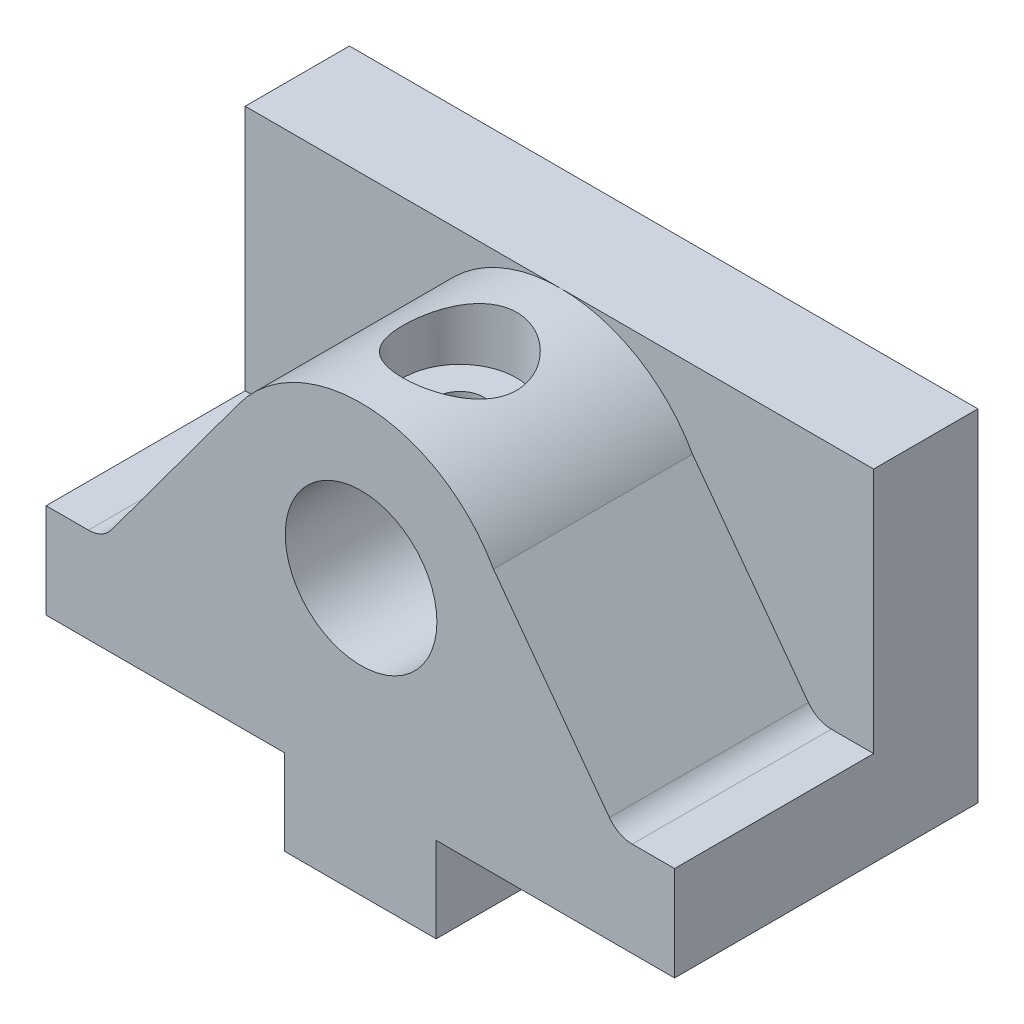
ISO-10303-21;
HEADER;
FILE_DESCRIPTION(('STEP AP214'),'2;1');
FILE_NAME('part.step','',(''),(''),'','','');
FILE_SCHEMA(('AUTOMOTIVE_DESIGN { 1 0 10303 214 1 1 1 1 }'));
ENDSEC;
DATA;
#1=APPLICATION_CONTEXT('core data for automotive mechanical design processes');
#2=APPLICATION_PROTOCOL_DEFINITION('international standard','automotive_design',2000,#1);
#3=PRODUCT_CONTEXT('',#1,'mechanical');
#4=PRODUCT('Part','Part','',(#3));
#5=PRODUCT_RELATED_PRODUCT_CATEGORY('part','',(#4));
#6=PRODUCT_DEFINITION_FORMATION('','',#4);
#7=PRODUCT_DEFINITION_CONTEXT('part definition',#1,'design');
#8=PRODUCT_DEFINITION('design','',#6,#7);
#9=PRODUCT_DEFINITION_SHAPE('','',#8);
#10=(LENGTH_UNIT() NAMED_UNIT(*) SI_UNIT(.MILLI.,.METRE.));
#11=(NAMED_UNIT(*) PLANE_ANGLE_UNIT() SI_UNIT($,.RADIAN.));
#12=(NAMED_UNIT(*) SI_UNIT($,.STERADIAN.) SOLID_ANGLE_UNIT());
#13=UNCERTAINTY_MEASURE_WITH_UNIT(LENGTH_MEASURE(1.E-05),#10,'distance_accuracy_value','');
#14=(GEOMETRIC_REPRESENTATION_CONTEXT(3) GLOBAL_UNCERTAINTY_ASSIGNED_CONTEXT((#13)) GLOBAL_UNIT_ASSIGNED_CONTEXT((#10,
#11,#12)) REPRESENTATION_CONTEXT('',''));
#15=CARTESIAN_POINT('',(0.,0.,0.));
#16=DIRECTION('',(0.,0.,1.));
#17=DIRECTION('',(1.,0.,0.));
#18=AXIS2_PLACEMENT_3D('',#15,#16,#17);
#19=CARTESIAN_POINT('',(0.,0.,0.));
#20=DIRECTION('',(0.,0.,1.));
#21=DIRECTION('',(1.,0.,0.));
#22=AXIS2_PLACEMENT_3D('',#19,#20,#21);
#23=PLANE('',#22);
#24=DIRECTION('',(-1.,0.,0.));
#25=VECTOR('',#24,1.);
#26=CARTESIAN_POINT('',(33.15,-16.,0.));
#27=LINE('',#26,#25);
#28=CARTESIAN_POINT('',(8.,-16.,0.));
#29=VERTEX_POINT('',#28);
#30=CARTESIAN_POINT('',(-8.,-16.,0.));
#31=VERTEX_POINT('',#30);
#32=EDGE_CURVE('E50',#29,#31,#27,.T.);
#33=ORIENTED_EDGE('',*,*,#32,.F.);
#34=DIRECTION('',(0.,1.,0.));
#35=VECTOR('',#34,1.);
#36=CARTESIAN_POINT('',(8.,0.,0.));
#37=LINE('',#36,#35);
#38=CARTESIAN_POINT('',(8.,-25.,0.));
#39=VERTEX_POINT('',#38);
#40=EDGE_CURVE('E182',#39,#29,#37,.T.);
#41=ORIENTED_EDGE('',*,*,#40,.F.);
#42=DIRECTION('',(1.,0.,0.));
#43=VECTOR('',#42,1.);
#44=CARTESIAN_POINT('',(0.,-25.,0.));
#45=LINE('',#44,#43);
#46=CARTESIAN_POINT('',(-8.,-25.,0.));
#47=VERTEX_POINT('',#46);
#48=EDGE_CURVE('E81',#47,#39,#45,.T.);
#49=ORIENTED_EDGE('',*,*,#48,.F.);
#50=DIRECTION('',(0.,-1.,0.));
#51=VECTOR('',#50,1.);
#52=CARTESIAN_POINT('',(-8.,0.,0.));
#53=LINE('',#52,#51);
#54=EDGE_CURVE('E74',#31,#47,#53,.T.);
#55=ORIENTED_EDGE('',*,*,#54,.F.);
#56=EDGE_LOOP('',(#33,#41,#49,#55));
#57=FACE_BOUND('',#56,.T.);
#58=ADVANCED_FACE('F37',(#57),#23,.F.);
#59=CARTESIAN_POINT('',(14.737760130452,10.8656138690284,21.));
#60=DIRECTION('',(0.804893797355911,0.593418886603705,0.));
#61=DIRECTION('',(-0.593418886603705,0.804893797355911,0.));
#62=AXIS2_PLACEMENT_3D('',#59,#60,#61);
#63=PLANE('',#62);
#64=DIRECTION('',(0.593418886603705,-0.804893797355911,0.));
#65=VECTOR('',#64,1.);
#66=CARTESIAN_POINT('',(14.737760130452,10.8656138690284,0.));
#67=LINE('',#66,#65);
#68=CARTESIAN_POINT('',(14.0487403505157,11.8001775636562,0.));
#69=VERTEX_POINT('',#68);
#70=CARTESIAN_POINT('',(26.2728907273948,-4.7802566598111,0.));
#71=VERTEX_POINT('',#70);
#72=EDGE_CURVE('E163',#69,#71,#67,.T.);
#73=ORIENTED_EDGE('',*,*,#72,.F.);
#74=DIRECTION('',(0.,0.,-1.));
#75=VECTOR('',#74,1.);
#76=CARTESIAN_POINT('',(14.0487403505157,11.8001775636562,21.));
#77=LINE('',#76,#75);
#78=CARTESIAN_POINT('',(14.0487403505157,11.8001775636562,21.));
#79=VERTEX_POINT('',#78);
#80=EDGE_CURVE('E89',#79,#69,#77,.T.);
#81=ORIENTED_EDGE('',*,*,#80,.F.);
#82=DIRECTION('',(0.593418886603705,-0.804893797355911,0.));
#83=VECTOR('',#82,1.);
#84=CARTESIAN_POINT('',(14.737760130452,10.8656138690284,21.));
#85=LINE('',#84,#83);
#86=CARTESIAN_POINT('',(26.2728907273948,-4.7802566598111,21.));
#87=VERTEX_POINT('',#86);
#88=EDGE_CURVE('E193',#79,#87,#85,.T.);
#89=ORIENTED_EDGE('',*,*,#88,.T.);
#90=DIRECTION('',(0.,0.,-1.));
#91=VECTOR('',#90,1.);
#92=CARTESIAN_POINT('',(26.2728907273948,-4.7802566598111,21.));
#93=LINE('',#92,#91);
#94=EDGE_CURVE('E58',#87,#71,#93,.T.);
#95=ORIENTED_EDGE('',*,*,#94,.T.);
#96=EDGE_LOOP('',(#73,#81,#89,#95));
#97=FACE_BOUND('',#96,.T.);
#98=ADVANCED_FACE('F39',(#97),#63,.T.);
#99=CARTESIAN_POINT('',(0.0788717049115105,4.,21.));
#100=DIRECTION('',(0.,0.,-1.));
#101=DIRECTION('',(-1.,0.,0.));
#102=AXIS2_PLACEMENT_3D('',#99,#100,#101);
#103=CYLINDRICAL_SURFACE('',#102,16.);
#104=CARTESIAN_POINT('',(0.,19.9998056005117,16.5));
#105=CARTESIAN_POINT('',(-0.162597875480662,19.9990046002663,16.5000007288626));
#106=CARTESIAN_POINT('',(-0.325173391870879,19.995718639908,16.4933854366661));
#107=CARTESIAN_POINT('',(-0.649138194896601,19.9842508954801,16.466995699932));
#108=CARTESIAN_POINT('',(-0.810527057658233,19.9760674405622,16.4472167641761));
#109=CARTESIAN_POINT('',(-1.13078166197335,19.9550142850118,16.3947138411218));
#110=CARTESIAN_POINT('',(-1.28964869250002,19.9421470645064,16.3619967040126));
#111=CARTESIAN_POINT('',(-1.60388528633919,19.9120474207244,16.283923659696));
#112=CARTESIAN_POINT('',(-1.7592534624636,19.8948132981638,16.238562831785));
#113=CARTESIAN_POINT('',(-2.06501428051281,19.8564636415179,16.1357492956797));
#114=CARTESIAN_POINT('',(-2.21541800053417,19.8353575518401,16.0783259616611));
#115=CARTESIAN_POINT('',(-2.5107498974902,19.7897497261244,15.951784509422));
#116=CARTESIAN_POINT('',(-2.65567602022029,19.7652467319505,15.8826620560099));
#117=CARTESIAN_POINT('',(-2.93911672030895,19.7134496809109,15.7332832241983));
#118=CARTESIAN_POINT('',(-3.07763224861664,19.6861560399505,15.6530285042676));
#119=CARTESIAN_POINT('',(-3.34755017289116,19.6294165638612,15.4819125836238));
#120=CARTESIAN_POINT('',(-3.47894997600853,19.5999699532904,15.3910475542561));
#121=CARTESIAN_POINT('',(-3.73884381576997,19.538454493063,15.19558330503));
#122=CARTESIAN_POINT('',(-3.86702595466461,19.5063281965068,15.0905873088505));
#123=CARTESIAN_POINT('',(-4.11417333234845,19.4413310328946,14.8704649698221));
#124=CARTESIAN_POINT('',(-4.23313830489977,19.4084601443665,14.7553383345546));
#125=CARTESIAN_POINT('',(-4.46122140919626,19.3428043873285,14.515581152897));
#126=CARTESIAN_POINT('',(-4.57033490036089,19.3100195663481,14.3909461780393));
#127=CARTESIAN_POINT('',(-4.77796061785949,19.2454255113921,14.1329737382526));
#128=CARTESIAN_POINT('',(-4.87647643110741,19.2136159499509,13.9996392424858));
#129=CARTESIAN_POINT('',(-5.06586799817801,19.1506433016703,13.719722871633));
#130=CARTESIAN_POINT('',(-5.1563077404197,19.119551409726,13.5728294324502));
#131=CARTESIAN_POINT('',(-5.32438637622011,19.0603035766139,13.2714028387049));
#132=CARTESIAN_POINT('',(-5.40203043794046,19.0321464517942,13.1168728014997));
#133=CARTESIAN_POINT('',(-5.54389918412248,18.9796586455666,12.8011171038103));
#134=CARTESIAN_POINT('',(-5.60812248555749,18.9553283585832,12.6398907553126));
#135=CARTESIAN_POINT('',(-5.72248773771458,18.9113375216964,12.3119786731396));
#136=CARTESIAN_POINT('',(-5.77263654057185,18.8916747001704,12.1452956403285));
#137=CARTESIAN_POINT('',(-5.85653064325913,18.8584302139801,11.8148606524755));
#138=CARTESIAN_POINT('',(-5.89088237292996,18.8446256661589,11.6512850703775));
#139=CARTESIAN_POINT('',(-5.94583747612751,18.8224074031864,11.321546200458));
#140=CARTESIAN_POINT('',(-5.96644690073887,18.8139913154246,11.1553840845798));
#141=CARTESIAN_POINT('',(-5.99370365788102,18.8028391322993,10.8217538870913));
#142=CARTESIAN_POINT('',(-6.00035317407108,18.8001021485906,10.6542860138465));
#143=CARTESIAN_POINT('',(-5.99961795227876,18.8004042197552,10.3193897199229));
#144=CARTESIAN_POINT('',(-5.99223376879577,18.8034430464148,10.1519612979467));
#145=CARTESIAN_POINT('',(-5.96440529544634,18.8148239363387,9.82878030580884));
#146=CARTESIAN_POINT('',(-5.94479273184622,18.822828112734,9.67294331084163));
#147=CARTESIAN_POINT('',(-5.89347606307572,18.8435786664687,9.36354148897527));
#148=CARTESIAN_POINT('',(-5.86176794879023,18.8563266161151,9.20997743300024));
#149=CARTESIAN_POINT('',(-5.78657137684794,18.8861751355065,8.90624189653167));
#150=CARTESIAN_POINT('',(-5.74308594278921,18.9032745880197,8.75606955598689));
#151=CARTESIAN_POINT('',(-5.64469534376389,18.9413373124076,8.45995933227345));
#152=CARTESIAN_POINT('',(-5.5897858078627,18.9623020628195,8.31402309428915));
#153=CARTESIAN_POINT('',(-5.46783755557311,19.0079423401382,8.02454209573903));
#154=CARTESIAN_POINT('',(-5.40058633917315,19.032681345374,7.88109693907999));
#155=CARTESIAN_POINT('',(-5.25517054267194,19.0848917879836,7.60031218287696));
#156=CARTESIAN_POINT('',(-5.17700225456706,19.1123641528324,7.46297467879231));
#157=CARTESIAN_POINT('',(-5.0102874788706,19.1693182520026,7.19517008102259));
#158=CARTESIAN_POINT('',(-4.92173979689313,19.1988002174106,7.06470378053458));
#159=CARTESIAN_POINT('',(-4.73481295801729,19.2590327782618,6.81132338881349));
#160=CARTESIAN_POINT('',(-4.63643334249973,19.2897834328447,6.68840965030855));
#161=CARTESIAN_POINT('',(-4.42325162525514,19.3539609394907,6.44252263027109));
#162=CARTESIAN_POINT('',(-4.30778391781587,19.3874255754358,6.32013548113781));
#163=CARTESIAN_POINT('',(-4.06697642974933,19.4540461733923,6.08548326582083));
#164=CARTESIAN_POINT('',(-3.94163963069466,19.4872022252714,5.97321516436559));
#165=CARTESIAN_POINT('',(-3.68172451053045,19.5523590680355,5.75940553093412));
#166=CARTESIAN_POINT('',(-3.54714121689138,19.5843592229709,5.65786984626786));
#167=CARTESIAN_POINT('',(-3.2696425671514,19.6463303375856,5.46632847252391));
#168=CARTESIAN_POINT('',(-3.12673055368211,19.6763021010388,5.37631820360189));
#169=CARTESIAN_POINT('',(-2.83084097503339,19.7339339657032,5.2069956619691));
#170=CARTESIAN_POINT('',(-2.67773160503509,19.7615448143443,5.12789660200632));
#171=CARTESIAN_POINT('',(-2.36481792766893,19.8130803349705,4.98299442543059));
#172=CARTESIAN_POINT('',(-2.20501630347863,19.8370064666375,4.91718604055067));
#173=CARTESIAN_POINT('',(-1.8798226830721,19.8805043854684,4.7994593846713));
#174=CARTESIAN_POINT('',(-1.71443154149499,19.900076834873,4.74753900091751));
#175=CARTESIAN_POINT('',(-1.3793004219006,19.9343056453706,4.65811657866493));
#176=CARTESIAN_POINT('',(-1.20956070826838,19.9489623045746,4.62061366581936));
#177=CARTESIAN_POINT('',(-0.876240061379153,19.9722938226187,4.56204649754794));
#178=CARTESIAN_POINT('',(-0.712813527565855,19.9812460401906,4.54021213397568));
#179=CARTESIAN_POINT('',(-0.384523603016817,19.9941315625461,4.51006606080527));
#180=CARTESIAN_POINT('',(-0.219660274748985,19.9980650844438,4.50175376622407));
#181=CARTESIAN_POINT('',(0.110199769038095,20.0008193034233,4.49874547756202));
#182=CARTESIAN_POINT('',(0.27519645166177,19.9996410132456,4.50404678630002));
#183=CARTESIAN_POINT('',(0.604076963418254,19.9922234908994,4.52820997357424));
#184=CARTESIAN_POINT('',(0.767960810921134,19.9859843424785,4.54707162771171));
#185=CARTESIAN_POINT('',(1.08684439337686,19.9689843363227,4.59713903301461));
#186=CARTESIAN_POINT('',(1.2419370998143,19.9584145417338,4.62782025634377));
#187=CARTESIAN_POINT('',(1.54894456169723,19.9330668122344,4.70123378567702));
#188=CARTESIAN_POINT('',(1.70085825311639,19.9182874918213,4.74397005937631));
#189=CARTESIAN_POINT('',(2.00042622233181,19.8849091514048,4.8411057957064));
#190=CARTESIAN_POINT('',(2.14808166692555,19.8663111893052,4.89550202828439));
#191=CARTESIAN_POINT('',(2.43832789150545,19.8257527408023,5.0155463816344));
#192=CARTESIAN_POINT('',(2.58091672437084,19.8037909785319,5.08119877292567));
#193=CARTESIAN_POINT('',(2.86401314650287,19.7564003183358,5.22521635259312));
#194=CARTESIAN_POINT('',(3.0043541646735,19.7308923415817,5.30388286832287));
#195=CARTESIAN_POINT('',(3.2779969334092,19.677532971866,5.47202476683449));
#196=CARTESIAN_POINT('',(3.41129624435998,19.6496807752991,5.56150386081649));
#197=CARTESIAN_POINT('',(3.670091977007,19.5923284835017,5.7506717776728));
#198=CARTESIAN_POINT('',(3.79558730281286,19.5628281579285,5.85036202928969));
#199=CARTESIAN_POINT('',(4.03808530524385,19.5029103806121,6.05933690474149));
#200=CARTESIAN_POINT('',(4.15508766986317,19.4724928952333,6.16862188073212));
#201=CARTESIAN_POINT('',(4.38646580046857,19.4097313478496,6.40273947537762));
#202=CARTESIAN_POINT('',(4.50029991492092,19.3773774462054,6.52810545378596));
#203=CARTESIAN_POINT('',(4.71701594958987,19.3134053222147,6.7880746461822));
#204=CARTESIAN_POINT('',(4.8199013580719,19.2817868680781,6.92267489551107));
#205=CARTESIAN_POINT('',(5.01413007017098,19.2201712689675,7.20041985036751));
#206=CARTESIAN_POINT('',(5.10546757630218,19.1901749426538,7.34356879498736));
#207=CARTESIAN_POINT('',(5.27583869722682,19.1327332683385,7.63742131457219));
#208=CARTESIAN_POINT('',(5.35487745157578,19.1052868566894,7.78812169885227));
#209=CARTESIAN_POINT('',(5.50046227951491,19.0536493510489,8.09703713087115));
#210=CARTESIAN_POINT('',(5.56693629688538,19.0294772459765,8.25528936846913));
#211=CARTESIAN_POINT('',(5.68620944188024,18.9853865245205,8.57737203366088));
#212=CARTESIAN_POINT('',(5.73901425861978,18.9654661391807,8.7412001083668));
#213=CARTESIAN_POINT('',(5.83043670465923,18.9305692286101,9.07323802415519));
#214=CARTESIAN_POINT('',(5.86905841377772,18.915591281796,9.24144659024155));
#215=CARTESIAN_POINT('',(5.93170627964781,18.8911203012282,9.58095090903826));
#216=CARTESIAN_POINT('',(5.95573342229305,18.8816268969842,9.75224645241172));
#217=CARTESIAN_POINT('',(5.98787856954863,18.8688908051387,10.0857516860936));
#218=CARTESIAN_POINT('',(5.99689519681476,18.8652952543096,10.2478618747385));
#219=CARTESIAN_POINT('',(6.00175729462009,18.8633588042937,10.5723093456874));
#220=CARTESIAN_POINT('',(5.99760319139971,18.8650177350576,10.7346466204724));
#221=CARTESIAN_POINT('',(5.9761698743065,18.8735337288522,11.0582963603953));
#222=CARTESIAN_POINT('',(5.95889191968373,18.8803902931631,11.2196089223584));
#223=CARTESIAN_POINT('',(5.91139435919661,18.8990714135797,11.5400227599637));
#224=CARTESIAN_POINT('',(5.88117476358134,18.910895965751,11.699124037357));
#225=CARTESIAN_POINT('',(5.809196590441,18.9387019274852,12.0092409779039));
#226=CARTESIAN_POINT('',(5.76781209247374,18.9545477295621,12.160355939962));
#227=CARTESIAN_POINT('',(5.67350338552309,18.9900845337431,12.4585251216294));
#228=CARTESIAN_POINT('',(5.62057537229106,19.0097768032543,12.6055779845021));
#229=CARTESIAN_POINT('',(5.50361606975496,19.0524423031683,12.8946847594003));
#230=CARTESIAN_POINT('',(5.43958645208076,19.0754150395213,13.0367394201645));
#231=CARTESIAN_POINT('',(5.30088763864341,19.1240189176861,13.3151029100444));
#232=CARTESIAN_POINT('',(5.22621459569243,19.1496510198404,13.4514096383169));
#233=CARTESIAN_POINT('',(4.97884567622273,19.2322517396299,13.8641102427098));
#234=CARTESIAN_POINT('',(4.78870330000843,19.2926665169483,14.1296104002842));
#235=CARTESIAN_POINT('',(4.36823694104577,19.4158739284026,14.6260614243027));
#236=CARTESIAN_POINT('',(4.13790050279399,19.4786672948894,14.8570015398077));
#237=CARTESIAN_POINT('',(3.75990823604686,19.5713861973601,15.1789395307698));
#238=CARTESIAN_POINT('',(3.62472407690408,19.6028003622086,15.2844349773795));
#239=CARTESIAN_POINT('',(3.34554222464252,19.6636278296377,15.4836450646937));
#240=CARTESIAN_POINT('',(3.20154785841023,19.6930418787453,15.5773641120417));
#241=CARTESIAN_POINT('',(2.90556519677744,19.7490477597173,15.7523585438081));
#242=CARTESIAN_POINT('',(2.75357281936602,19.7756381291284,15.8336274895635));
#243=CARTESIAN_POINT('',(2.44273691747004,19.8251980841407,15.9829507645544));
#244=CARTESIAN_POINT('',(2.2838963416415,19.8481692086509,16.0510107131467));
#245=CARTESIAN_POINT('',(1.95385620451022,19.8906645537248,16.1758099575454));
#246=CARTESIAN_POINT('',(1.78241670495136,19.9100108662512,16.2319771334101));
#247=CARTESIAN_POINT('',(1.43468147241197,19.9434088623455,16.3287442678316));
#248=CARTESIAN_POINT('',(1.25838551259143,19.9574602981438,16.3693434979004));
#249=CARTESIAN_POINT('',(0.902560466186597,19.9797778343926,16.4344826820826));
#250=CARTESIAN_POINT('',(0.723032713774107,19.9880462684812,16.4590291137865));
#251=CARTESIAN_POINT('',(0.362327271278668,19.9985060229379,16.4917864945467));
#252=CARTESIAN_POINT('',(0.181149759459267,20.0006979922563,16.4999991879765));
#253=CARTESIAN_POINT('',(0.,19.9998056005117,16.5));
#254=B_SPLINE_CURVE_WITH_KNOTS('',3,(#104,#105,#106,#107,#108,#109,#110,#111,#112,#113,#114,
#115,#116,#117,#118,#119,#120,#121,#122,#123,#124,#125,#126,#127,#128,#129,#130,#131,#132,#133,
#134,#135,#136,#137,#138,#139,#140,#141,#142,#143,#144,#145,#146,#147,#148,#149,#150,#151,#152,
#153,#154,#155,#156,#157,#158,#159,#160,#161,#162,#163,#164,#165,#166,#167,#168,#169,#170,#171,
#172,#173,#174,#175,#176,#177,#178,#179,#180,#181,#182,#183,#184,#185,#186,#187,#188,#189,#190,
#191,#192,#193,#194,#195,#196,#197,#198,#199,#200,#201,#202,#203,#204,#205,#206,#207,#208,#209,
#210,#211,#212,#213,#214,#215,#216,#217,#218,#219,#220,#221,#222,#223,#224,#225,#226,#227,#228,
#229,#230,#231,#232,#233,#234,#235,#236,#237,#238,#239,#240,#241,#242,#243,#244,#245,#246,#247,
#248,#249,#250,#251,#252,#253),.UNSPECIFIED.,.T.,.F.,(4,2,2,2,2,2,2,2,2,2,2,2,2,2,2,2,2,2,2,2,2,
2,2,2,2,2,2,2,2,2,2,2,2,2,2,2,2,2,2,2,2,2,2,2,2,2,2,2,2,2,2,2,2,2,2,2,2,2,2,2,2,2,2,2,2,2,2,2,2,
2,2,2,2,2,4),(0.,0.487629561734407,0.975425579983174,1.46296367745953,1.95069178181011,
2.43724567836593,2.92398026723524,3.41064242082221,3.89748072883251,4.40325808298447,
4.90905004107425,5.41507902485078,5.92093619443516,6.44613055011304,6.97111225768887,
7.49614803865779,8.02092776207237,8.52341030165571,9.02567143909617,9.52785400518064,
10.0300167294454,10.50127484445,10.9726892956163,11.4439828348169,11.9154570266497,
12.3959770115888,12.8766606047581,13.3573995659353,13.83816096208,14.352238180801,
14.8661606820793,15.380361754413,15.8943578607971,16.4172906644987,16.9400157751937,
17.4626613194597,17.9852751629119,18.4800139696051,18.9747313726573,19.4693507678962,
19.9639619782832,20.438767843489,20.9137301649047,21.388561081461,21.8635725462865,
22.3517186662211,22.8400328109518,23.3284153740485,23.8168158697778,24.3334140877185,
24.8498472212089,25.3665386028442,25.8830134797889,26.4023658871841,26.9215017915409,
27.4404882475215,27.9594396409767,28.4460306390161,28.9326058898177,29.4191344590083,
29.9056626428956,30.3775690235,30.8496311598866,31.3216222769048,31.793784435216,
32.7854976001456,33.7775186287991,34.2999716155882,34.8222285183583,35.3447546049887,
35.867057909541,36.4105764667135,36.9541204542421,37.4974449765213,38.0407114709468),.UNSPECIFIED.);
#255=CARTESIAN_POINT('',(0.,19.9998056005117,16.5));
#256=VERTEX_POINT('',#255);
#257=EDGE_CURVE('E11',#256,#256,#254,.T.);
#258=ORIENTED_EDGE('',*,*,#257,.T.);
#259=EDGE_LOOP('',(#258));
#260=FACE_BOUND('',#259,.T.);
#261=CARTESIAN_POINT('',(0.0788717049115105,4.,0.));
#262=DIRECTION('',(0.,0.,1.));
#263=DIRECTION('',(1.,0.,0.));
#264=AXIS2_PLACEMENT_3D('',#261,#262,#263);
#265=CIRCLE('',#264,16.);
#266=CARTESIAN_POINT('',(0.0788717049115123,20.,0.));
#267=VERTEX_POINT('',#266);
#268=EDGE_CURVE('E168',#69,#267,#265,.T.);
#269=ORIENTED_EDGE('',*,*,#268,.T.);
#270=CARTESIAN_POINT('',(-12.7994290527831,13.4947021856593,0.));
#271=VERTEX_POINT('',#270);
#272=EDGE_CURVE('E166',#267,#271,#265,.T.);
#273=ORIENTED_EDGE('',*,*,#272,.T.);
#274=DIRECTION('',(0.,0.,-1.));
#275=VECTOR('',#274,1.);
#276=CARTESIAN_POINT('',(-12.7994290527831,13.4947021856593,21.));
#277=LINE('',#276,#275);
#278=CARTESIAN_POINT('',(-12.7994290527831,13.4947021856593,21.));
#279=VERTEX_POINT('',#278);
#280=EDGE_CURVE('E218',#279,#271,#277,.T.);
#281=ORIENTED_EDGE('',*,*,#280,.F.);
#282=CARTESIAN_POINT('',(0.0788717049115105,4.,21.));
#283=DIRECTION('',(0.,0.,1.));
#284=DIRECTION('',(1.,0.,0.));
#285=AXIS2_PLACEMENT_3D('',#282,#283,#284);
#286=CIRCLE('',#285,16.);
#287=EDGE_CURVE('E243',#79,#279,#286,.T.);
#288=ORIENTED_EDGE('',*,*,#287,.F.);
#289=ORIENTED_EDGE('',*,*,#80,.T.);
#290=EDGE_LOOP('',(#269,#273,#281,#288,#289));
#291=FACE_BOUND('',#290,.T.);
#292=ADVANCED_FACE('F315',(#260,#291),#103,.T.);
#293=CARTESIAN_POINT('',(-14.737760130452,10.8656138690284,21.));
#294=DIRECTION('',(0.804893797355911,-0.593418886603705,0.));
#295=DIRECTION('',(0.593418886603705,0.804893797355911,0.));
#296=AXIS2_PLACEMENT_3D('',#293,#294,#295);
#297=PLANE('',#296);
#298=DIRECTION('',(-0.593418886603705,-0.804893797355911,0.));
#299=VECTOR('',#298,1.);
#300=CARTESIAN_POINT('',(-14.737760130452,10.8656138690284,0.));
#301=LINE('',#300,#299);
#302=CARTESIAN_POINT('',(-26.2728907273948,-4.78025665981111,0.));
#303=VERTEX_POINT('',#302);
#304=EDGE_CURVE('E171',#271,#303,#301,.T.);
#305=ORIENTED_EDGE('',*,*,#304,.T.);
#306=DIRECTION('',(0.,0.,-1.));
#307=VECTOR('',#306,1.);
#308=CARTESIAN_POINT('',(-26.2728907273948,-4.78025665981111,21.));
#309=LINE('',#308,#307);
#310=CARTESIAN_POINT('',(-26.2728907273948,-4.78025665981111,21.));
#311=VERTEX_POINT('',#310);
#312=EDGE_CURVE('E215',#311,#303,#309,.T.);
#313=ORIENTED_EDGE('',*,*,#312,.F.);
#314=DIRECTION('',(-0.593418886603705,-0.804893797355911,0.));
#315=VECTOR('',#314,1.);
#316=CARTESIAN_POINT('',(-14.737760130452,10.8656138690284,21.));
#317=LINE('',#316,#315);
#318=EDGE_CURVE('E245',#279,#311,#317,.T.);
#319=ORIENTED_EDGE('',*,*,#318,.F.);
#320=ORIENTED_EDGE('',*,*,#280,.T.);
#321=EDGE_LOOP('',(#305,#313,#319,#320));
#322=FACE_BOUND('',#321,.T.);
#323=ADVANCED_FACE('F320',(#322),#297,.F.);
#324=CARTESIAN_POINT('',(-28.6875721194625,-3.,21.));
#325=DIRECTION('',(0.,0.,-1.));
#326=DIRECTION('',(-1.,0.,0.));
#327=AXIS2_PLACEMENT_3D('',#324,#325,#326);
#328=CYLINDRICAL_SURFACE('',#327,3.);
#329=CARTESIAN_POINT('',(-28.6875721194625,-3.,0.));
#330=DIRECTION('',(0.,0.,1.));
#331=DIRECTION('',(1.,0.,0.));
#332=AXIS2_PLACEMENT_3D('',#329,#330,#331);
#333=CIRCLE('',#332,3.);
#334=CARTESIAN_POINT('',(-28.6875721194625,-6.,0.));
#335=VERTEX_POINT('',#334);
#336=EDGE_CURVE('E174',#303,#335,#333,.F.);
#337=ORIENTED_EDGE('',*,*,#336,.T.);
#338=DIRECTION('',(0.,0.,-1.));
#339=VECTOR('',#338,1.);
#340=CARTESIAN_POINT('',(-28.6875721194625,-6.,21.));
#341=LINE('',#340,#339);
#342=CARTESIAN_POINT('',(-28.6875721194625,-6.,21.));
#343=VERTEX_POINT('',#342);
#344=EDGE_CURVE('E212',#343,#335,#341,.T.);
#345=ORIENTED_EDGE('',*,*,#344,.F.);
#346=CARTESIAN_POINT('',(-28.6875721194625,-3.,21.));
#347=DIRECTION('',(0.,0.,1.));
#348=DIRECTION('',(1.,0.,0.));
#349=AXIS2_PLACEMENT_3D('',#346,#347,#348);
#350=CIRCLE('',#349,3.);
#351=EDGE_CURVE('E247',#311,#343,#350,.F.);
#352=ORIENTED_EDGE('',*,*,#351,.F.);
#353=ORIENTED_EDGE('',*,*,#312,.T.);
#354=EDGE_LOOP('',(#337,#345,#352,#353));
#355=FACE_BOUND('',#354,.T.);
#356=ADVANCED_FACE('F356',(#355),#328,.F.);
#357=CARTESIAN_POINT('',(0.,-5.99999999999999,21.));
#358=DIRECTION('',(0.,1.,0.));
#359=DIRECTION('',(-1.,0.,0.));
#360=AXIS2_PLACEMENT_3D('',#357,#358,#359);
#361=PLANE('',#360);
#362=DIRECTION('',(1.,0.,0.));
#363=VECTOR('',#362,1.);
#364=CARTESIAN_POINT('',(0.,-5.99999999999999,0.));
#365=LINE('',#364,#363);
#366=CARTESIAN_POINT('',(-33.15,-6.,0.));
#367=VERTEX_POINT('',#366);
#368=EDGE_CURVE('E177',#367,#335,#365,.T.);
#369=ORIENTED_EDGE('',*,*,#368,.F.);
#370=DIRECTION('',(0.,0.,-1.));
#371=VECTOR('',#370,1.);
#372=CARTESIAN_POINT('',(-33.15,-6.,21.));
#373=LINE('',#372,#371);
#374=CARTESIAN_POINT('',(-33.15,-6.,21.));
#375=VERTEX_POINT('',#374);
#376=EDGE_CURVE('E209',#375,#367,#373,.T.);
#377=ORIENTED_EDGE('',*,*,#376,.F.);
#378=DIRECTION('',(1.,0.,0.));
#379=VECTOR('',#378,1.);
#380=CARTESIAN_POINT('',(0.,-5.99999999999999,21.));
#381=LINE('',#380,#379);
#382=EDGE_CURVE('E249',#375,#343,#381,.T.);
#383=ORIENTED_EDGE('',*,*,#382,.T.);
#384=ORIENTED_EDGE('',*,*,#344,.T.);
#385=EDGE_LOOP('',(#369,#377,#383,#384));
#386=FACE_BOUND('',#385,.T.);
#387=ADVANCED_FACE('F352',(#386),#361,.T.);
#388=CARTESIAN_POINT('',(-33.15,0.,21.));
#389=DIRECTION('',(-1.,0.,0.));
#390=DIRECTION('',(0.,-1.,0.));
#391=AXIS2_PLACEMENT_3D('',#388,#389,#390);
#392=PLANE('',#391);
#393=ORIENTED_EDGE('',*,*,#376,.T.);
#394=DIRECTION('',(0.,1.,0.));
#395=VECTOR('',#394,1.);
#396=CARTESIAN_POINT('',(-33.15,-16.,0.));
#397=LINE('',#396,#395);
#398=CARTESIAN_POINT('',(-33.15,20.,0.));
#399=VERTEX_POINT('',#398);
#400=EDGE_CURVE('E229',#367,#399,#397,.T.);
#401=ORIENTED_EDGE('',*,*,#400,.T.);
#402=DIRECTION('',(0.,0.,1.));
#403=VECTOR('',#402,1.);
#404=CARTESIAN_POINT('',(-33.15,20.,-11.));
#405=LINE('',#404,#403);
#406=CARTESIAN_POINT('',(-33.15,20.,-11.));
#407=VERTEX_POINT('',#406);
#408=EDGE_CURVE('E167',#407,#399,#405,.T.);
#409=ORIENTED_EDGE('',*,*,#408,.F.);
#410=DIRECTION('',(0.,1.,0.));
#411=VECTOR('',#410,1.);
#412=CARTESIAN_POINT('',(-33.15,-16.,-11.));
#413=LINE('',#412,#411);
#414=CARTESIAN_POINT('',(-33.15,-16.,-11.));
#415=VERTEX_POINT('',#414);
#416=EDGE_CURVE('E378',#415,#407,#413,.T.);
#417=ORIENTED_EDGE('',*,*,#416,.F.);
#418=DIRECTION('',(0.,0.,-1.));
#419=VECTOR('',#418,1.);
#420=CARTESIAN_POINT('',(-33.15,-16.,21.));
#421=LINE('',#420,#419);
#422=CARTESIAN_POINT('',(-33.15,-16.,21.));
#423=VERTEX_POINT('',#422);
#424=EDGE_CURVE('E206',#423,#415,#421,.T.);
#425=ORIENTED_EDGE('',*,*,#424,.F.);
#426=DIRECTION('',(0.,1.,0.));
#427=VECTOR('',#426,1.);
#428=CARTESIAN_POINT('',(-33.15,0.,21.));
#429=LINE('',#428,#427);
#430=EDGE_CURVE('E252',#423,#375,#429,.T.);
#431=ORIENTED_EDGE('',*,*,#430,.T.);
#432=EDGE_LOOP('',(#393,#401,#409,#417,#425,#431));
#433=FACE_BOUND('',#432,.T.);
#434=ADVANCED_FACE('F349',(#433),#392,.T.);
#435=CARTESIAN_POINT('',(-8.,0.,21.));
#436=DIRECTION('',(1.,0.,0.));
#437=DIRECTION('',(0.,0.,-1.));
#438=AXIS2_PLACEMENT_3D('',#435,#436,#437);
#439=PLANE('',#438);
#440=ORIENTED_EDGE('',*,*,#54,.T.);
#441=DIRECTION('',(0.,0.,-1.));
#442=VECTOR('',#441,1.);
#443=CARTESIAN_POINT('',(-8.,-25.,21.));
#444=LINE('',#443,#442);
#445=CARTESIAN_POINT('',(-8.,-25.,21.));
#446=VERTEX_POINT('',#445);
#447=EDGE_CURVE('E202',#446,#47,#444,.T.);
#448=ORIENTED_EDGE('',*,*,#447,.F.);
#449=DIRECTION('',(0.,-1.,0.));
#450=VECTOR('',#449,1.);
#451=CARTESIAN_POINT('',(-8.,0.,21.));
#452=LINE('',#451,#450);
#453=CARTESIAN_POINT('',(-8.,-16.,21.));
#454=VERTEX_POINT('',#453);
#455=EDGE_CURVE('E257',#454,#446,#452,.T.);
#456=ORIENTED_EDGE('',*,*,#455,.F.);
#457=DIRECTION('',(0.,0.,-1.));
#458=VECTOR('',#457,1.);
#459=CARTESIAN_POINT('',(-8.,-16.,21.));
#460=LINE('',#459,#458);
#461=EDGE_CURVE('E204',#454,#31,#460,.T.);
#462=ORIENTED_EDGE('',*,*,#461,.T.);
#463=EDGE_LOOP('',(#440,#448,#456,#462));
#464=FACE_BOUND('',#463,.T.);
#465=ADVANCED_FACE('F346',(#464),#439,.F.);
#466=CARTESIAN_POINT('',(0.,-25.,21.));
#467=DIRECTION('',(0.,1.,0.));
#468=DIRECTION('',(0.,0.,1.));
#469=AXIS2_PLACEMENT_3D('',#466,#467,#468);
#470=PLANE('',#469);
#471=ORIENTED_EDGE('',*,*,#48,.T.);
#472=DIRECTION('',(0.,0.,-1.));
#473=VECTOR('',#472,1.);
#474=CARTESIAN_POINT('',(8.,-25.,21.));
#475=LINE('',#474,#473);
#476=CARTESIAN_POINT('',(8.,-25.,21.));
#477=VERTEX_POINT('',#476);
#478=EDGE_CURVE('E200',#477,#39,#475,.T.);
#479=ORIENTED_EDGE('',*,*,#478,.F.);
#480=DIRECTION('',(1.,0.,0.));
#481=VECTOR('',#480,1.);
#482=CARTESIAN_POINT('',(0.,-25.,21.));
#483=LINE('',#482,#481);
#484=EDGE_CURVE('E259',#446,#477,#483,.T.);
#485=ORIENTED_EDGE('',*,*,#484,.F.);
#486=ORIENTED_EDGE('',*,*,#447,.T.);
#487=EDGE_LOOP('',(#471,#479,#485,#486));
#488=FACE_BOUND('',#487,.T.);
#489=ADVANCED_FACE('F343',(#488),#470,.F.);
#490=CARTESIAN_POINT('',(8.,0.,21.));
#491=DIRECTION('',(-1.,0.,0.));
#492=DIRECTION('',(0.,0.,1.));
#493=AXIS2_PLACEMENT_3D('',#490,#491,#492);
#494=PLANE('',#493);
#495=ORIENTED_EDGE('',*,*,#40,.T.);
#496=DIRECTION('',(0.,0.,-1.));
#497=VECTOR('',#496,1.);
#498=CARTESIAN_POINT('',(8.,-16.,21.));
#499=LINE('',#498,#497);
#500=CARTESIAN_POINT('',(8.,-16.,21.));
#501=VERTEX_POINT('',#500);
#502=EDGE_CURVE('E197',#501,#29,#499,.T.);
#503=ORIENTED_EDGE('',*,*,#502,.F.);
#504=DIRECTION('',(0.,1.,0.));
#505=VECTOR('',#504,1.);
#506=CARTESIAN_POINT('',(8.,0.,21.));
#507=LINE('',#506,#505);
#508=EDGE_CURVE('E261',#477,#501,#507,.T.);
#509=ORIENTED_EDGE('',*,*,#508,.F.);
#510=ORIENTED_EDGE('',*,*,#478,.T.);
#511=EDGE_LOOP('',(#495,#503,#509,#510));
#512=FACE_BOUND('',#511,.T.);
#513=ADVANCED_FACE('F266',(#512),#494,.F.);
#514=CARTESIAN_POINT('',(0.,-16.,21.));
#515=DIRECTION('',(0.,1.,0.));
#516=DIRECTION('',(0.,0.,1.));
#517=AXIS2_PLACEMENT_3D('',#514,#515,#516);
#518=PLANE('',#517);
#519=ORIENTED_EDGE('',*,*,#502,.T.);
#520=ORIENTED_EDGE('',*,*,#32,.T.);
#521=ORIENTED_EDGE('',*,*,#461,.F.);
#522=DIRECTION('',(1.,0.,0.));
#523=VECTOR('',#522,1.);
#524=CARTESIAN_POINT('',(0.,-16.,21.));
#525=LINE('',#524,#523);
#526=EDGE_CURVE('E255',#423,#454,#525,.T.);
#527=ORIENTED_EDGE('',*,*,#526,.F.);
#528=ORIENTED_EDGE('',*,*,#424,.T.);
#529=DIRECTION('',(-1.,0.,0.));
#530=VECTOR('',#529,1.);
#531=CARTESIAN_POINT('',(33.15,-16.,-11.));
#532=LINE('',#531,#530);
#533=CARTESIAN_POINT('',(33.15,-16.,-11.));
#534=VERTEX_POINT('',#533);
#535=EDGE_CURVE('E273',#534,#415,#532,.T.);
#536=ORIENTED_EDGE('',*,*,#535,.F.);
#537=DIRECTION('',(0.,0.,-1.));
#538=VECTOR('',#537,1.);
#539=CARTESIAN_POINT('',(33.15,-16.,21.));
#540=LINE('',#539,#538);
#541=CARTESIAN_POINT('',(33.15,-16.,21.));
#542=VERTEX_POINT('',#541);
#543=EDGE_CURVE('E150',#542,#534,#540,.T.);
#544=ORIENTED_EDGE('',*,*,#543,.F.);
#545=DIRECTION('',(1.,0.,0.));
#546=VECTOR('',#545,1.);
#547=CARTESIAN_POINT('',(0.,-16.,21.));
#548=LINE('',#547,#546);
#549=EDGE_CURVE('E135',#501,#542,#548,.T.);
#550=ORIENTED_EDGE('',*,*,#549,.F.);
#551=EDGE_LOOP('',(#519,#520,#521,#527,#528,#536,#544,#550));
#552=FACE_BOUND('',#551,.T.);
#553=ADVANCED_FACE('F269',(#552),#518,.F.);
#554=CARTESIAN_POINT('',(33.15,0.,21.));
#555=DIRECTION('',(-1.,0.,0.));
#556=DIRECTION('',(0.,-1.,0.));
#557=AXIS2_PLACEMENT_3D('',#554,#555,#556);
#558=PLANE('',#557);
#559=ORIENTED_EDGE('',*,*,#543,.T.);
#560=DIRECTION('',(0.,-1.,0.));
#561=VECTOR('',#560,1.);
#562=CARTESIAN_POINT('',(33.15,-16.,-11.));
#563=LINE('',#562,#561);
#564=CARTESIAN_POINT('',(33.15,20.,-11.));
#565=VERTEX_POINT('',#564);
#566=EDGE_CURVE('E236',#565,#534,#563,.T.);
#567=ORIENTED_EDGE('',*,*,#566,.F.);
#568=DIRECTION('',(0.,0.,1.));
#569=VECTOR('',#568,1.);
#570=CARTESIAN_POINT('',(33.15,20.,-11.));
#571=LINE('',#570,#569);
#572=CARTESIAN_POINT('',(33.15,20.,0.));
#573=VERTEX_POINT('',#572);
#574=EDGE_CURVE('E237',#565,#573,#571,.T.);
#575=ORIENTED_EDGE('',*,*,#574,.T.);
#576=DIRECTION('',(0.,-1.,0.));
#577=VECTOR('',#576,1.);
#578=CARTESIAN_POINT('',(33.15,-16.,0.));
#579=LINE('',#578,#577);
#580=CARTESIAN_POINT('',(33.15,-5.99999999999999,0.));
#581=VERTEX_POINT('',#580);
#582=EDGE_CURVE('E147',#573,#581,#579,.T.);
#583=ORIENTED_EDGE('',*,*,#582,.T.);
#584=DIRECTION('',(0.,0.,-1.));
#585=VECTOR('',#584,1.);
#586=CARTESIAN_POINT('',(33.15,-5.99999999999999,21.));
#587=LINE('',#586,#585);
#588=CARTESIAN_POINT('',(33.15,-5.99999999999999,21.));
#589=VERTEX_POINT('',#588);
#590=EDGE_CURVE('E142',#589,#581,#587,.T.);
#591=ORIENTED_EDGE('',*,*,#590,.F.);
#592=DIRECTION('',(0.,1.,0.));
#593=VECTOR('',#592,1.);
#594=CARTESIAN_POINT('',(33.15,0.,21.));
#595=LINE('',#594,#593);
#596=EDGE_CURVE('E125',#542,#589,#595,.T.);
#597=ORIENTED_EDGE('',*,*,#596,.F.);
#598=EDGE_LOOP('',(#559,#567,#575,#583,#591,#597));
#599=FACE_BOUND('',#598,.T.);
#600=ADVANCED_FACE('F143',(#599),#558,.F.);
#601=CARTESIAN_POINT('',(0.,-6.,21.));
#602=DIRECTION('',(0.,-1.,0.));
#603=DIRECTION('',(1.,0.,0.));
#604=AXIS2_PLACEMENT_3D('',#601,#602,#603);
#605=PLANE('',#604);
#606=DIRECTION('',(-1.,0.,0.));
#607=VECTOR('',#606,1.);
#608=CARTESIAN_POINT('',(0.,-6.,0.));
#609=LINE('',#608,#607);
#610=CARTESIAN_POINT('',(28.6875721194626,-6.,0.));
#611=VERTEX_POINT('',#610);
#612=EDGE_CURVE('E185',#581,#611,#609,.T.);
#613=ORIENTED_EDGE('',*,*,#612,.T.);
#614=DIRECTION('',(0.,0.,-1.));
#615=VECTOR('',#614,1.);
#616=CARTESIAN_POINT('',(28.6875721194626,-6.,21.));
#617=LINE('',#616,#615);
#618=CARTESIAN_POINT('',(28.6875721194626,-6.,21.));
#619=VERTEX_POINT('',#618);
#620=EDGE_CURVE('E151',#619,#611,#617,.T.);
#621=ORIENTED_EDGE('',*,*,#620,.F.);
#622=DIRECTION('',(-1.,0.,0.));
#623=VECTOR('',#622,1.);
#624=CARTESIAN_POINT('',(0.,-6.,21.));
#625=LINE('',#624,#623);
#626=EDGE_CURVE('E132',#589,#619,#625,.T.);
#627=ORIENTED_EDGE('',*,*,#626,.F.);
#628=ORIENTED_EDGE('',*,*,#590,.T.);
#629=EDGE_LOOP('',(#613,#621,#627,#628));
#630=FACE_BOUND('',#629,.T.);
#631=ADVANCED_FACE('F153',(#630),#605,.F.);
#632=CARTESIAN_POINT('',(28.6875721194626,-3.,21.));
#633=DIRECTION('',(0.,0.,-1.));
#634=DIRECTION('',(-1.,0.,0.));
#635=AXIS2_PLACEMENT_3D('',#632,#633,#634);
#636=CYLINDRICAL_SURFACE('',#635,3.);
#637=CARTESIAN_POINT('',(28.6875721194626,-3.,0.));
#638=DIRECTION('',(0.,0.,1.));
#639=DIRECTION('',(1.,0.,0.));
#640=AXIS2_PLACEMENT_3D('',#637,#638,#639);
#641=CIRCLE('',#640,3.);
#642=EDGE_CURVE('E187',#71,#611,#641,.T.);
#643=ORIENTED_EDGE('',*,*,#642,.F.);
#644=ORIENTED_EDGE('',*,*,#94,.F.);
#645=CARTESIAN_POINT('',(28.6875721194626,-3.,21.));
#646=DIRECTION('',(0.,0.,1.));
#647=DIRECTION('',(1.,0.,0.));
#648=AXIS2_PLACEMENT_3D('',#645,#646,#647);
#649=CIRCLE('',#648,3.);
#650=EDGE_CURVE('E155',#87,#619,#649,.T.);
#651=ORIENTED_EDGE('',*,*,#650,.T.);
#652=ORIENTED_EDGE('',*,*,#620,.T.);
#653=EDGE_LOOP('',(#643,#644,#651,#652));
#654=FACE_BOUND('',#653,.T.);
#655=ADVANCED_FACE('F312',(#654),#636,.F.);
#656=CARTESIAN_POINT('',(0.0788717049115105,4.,21.));
#657=DIRECTION('',(0.,0.,-1.));
#658=DIRECTION('',(-1.,0.,0.));
#659=AXIS2_PLACEMENT_3D('',#656,#657,#658);
#660=CYLINDRICAL_SURFACE('',#659,8.);
#661=CARTESIAN_POINT('',(0.,11.9996111939371,13.));
#662=CARTESIAN_POINT('',(-0.137127539440822,11.9982583508465,12.9999989160134));
#663=CARTESIAN_POINT('',(-0.274230880734205,11.993347702761,12.9886801871937));
#664=CARTESIAN_POINT('',(-0.544355757492545,11.9768363803783,12.9438562719834));
#665=CARTESIAN_POINT('',(-0.677376236984041,11.9652339904609,12.9103453956717));
#666=CARTESIAN_POINT('',(-0.935405073286371,11.9365030911028,12.8224060745413));
#667=CARTESIAN_POINT('',(-1.06042611973427,11.9193836078025,12.7680117680591));
#668=CARTESIAN_POINT('',(-1.29954704553601,11.8812842026063,12.6399953397218));
#669=CARTESIAN_POINT('',(-1.41364521801368,11.8603036788522,12.5663702194206));
#670=CARTESIAN_POINT('',(-1.63136382834225,11.8158689262034,12.399475887874));
#671=CARTESIAN_POINT('',(-1.73458292021486,11.7923604918571,12.305697537619));
#672=CARTESIAN_POINT('',(-1.92410067607369,11.7458145913021,12.1022394254235));
#673=CARTESIAN_POINT('',(-2.01039613224081,11.7227772151206,11.9925566556928));
#674=CARTESIAN_POINT('',(-2.16561613939152,11.6791241685114,11.7571582751779));
#675=CARTESIAN_POINT('',(-2.2340766451416,11.6585794684751,11.6311223383649));
#676=CARTESIAN_POINT('',(-2.3486455663023,11.6230430144697,11.3685419188422));
#677=CARTESIAN_POINT('',(-2.3947605054058,11.6080496401165,11.2320005166641));
#678=CARTESIAN_POINT('',(-2.46179301478132,11.5859237337686,10.9570793281903));
#679=CARTESIAN_POINT('',(-2.48349730100581,11.578546440115,10.8189115671722));
#680=CARTESIAN_POINT('',(-2.50355288359384,11.5717373481372,10.5407138807773));
#681=CARTESIAN_POINT('',(-2.50191071275643,11.572303327128,10.4006844872783));
#682=CARTESIAN_POINT('',(-2.47591793202139,11.5811088831114,10.1289382033023));
#683=CARTESIAN_POINT('',(-2.45251777768439,11.5890272644824,9.99711827423861));
#684=CARTESIAN_POINT('',(-2.38520660378258,11.6111471287962,9.73938546133669));
#685=CARTESIAN_POINT('',(-2.3412933159384,11.6253493065729,9.61347323244862));
#686=CARTESIAN_POINT('',(-2.23352086763879,11.6587240652302,9.36883510192037));
#687=CARTESIAN_POINT('',(-2.16936002505078,11.677971023838,9.25025267558554));
#688=CARTESIAN_POINT('',(-2.02313537684546,11.719282701295,9.0252322646938));
#689=CARTESIAN_POINT('',(-1.94106672565428,11.7413481821211,8.91879757902118));
#690=CARTESIAN_POINT('',(-1.75666007361153,11.787185808639,8.71566259779601));
#691=CARTESIAN_POINT('',(-1.65353159517817,11.8109888078032,8.61968553129313));
#692=CARTESIAN_POINT('',(-1.43237516126917,11.8567721552861,8.44620980681444));
#693=CARTESIAN_POINT('',(-1.31434582561862,11.8787523344554,8.36871286246219));
#694=CARTESIAN_POINT('',(-1.06510727930428,11.9187992165039,8.23376456455793));
#695=CARTESIAN_POINT('',(-0.933776938581292,11.9368241294808,8.17652368402961));
#696=CARTESIAN_POINT('',(-0.662645058906502,11.9667259065251,8.08518160001664));
#697=CARTESIAN_POINT('',(-0.522846126255456,11.9786046515114,8.05107331624186));
#698=CARTESIAN_POINT('',(-0.244582940779542,11.9946256477134,8.0081692847961));
#699=CARTESIAN_POINT('',(-0.106278970586384,11.999051341709,7.99843893510504));
#700=CARTESIAN_POINT('',(0.170065306744719,12.0006727831424,8.00196795089948));
#701=CARTESIAN_POINT('',(0.308105652812699,11.9978696966401,8.01522360844584));
#702=CARTESIAN_POINT('',(0.576078731572234,11.9856310469858,8.06357414055359));
#703=CARTESIAN_POINT('',(0.706129886878781,11.976378227734,8.0980642945516));
#704=CARTESIAN_POINT('',(0.958594759363783,11.9524951649037,8.18720433944483));
#705=CARTESIAN_POINT('',(1.08100761366745,11.9378643150678,8.24185650317572));
#706=CARTESIAN_POINT('',(1.31773822758044,11.9044182069732,8.37111407110153));
#707=CARTESIAN_POINT('',(1.43181754821644,11.885517684717,8.44613342417582));
#708=CARTESIAN_POINT('',(1.64609041039131,11.8457454247717,8.61350078020343));
#709=CARTESIAN_POINT('',(1.74628030516044,11.8248731717999,8.70585331918548));
#710=CARTESIAN_POINT('',(1.93398755405292,11.7825557046462,8.90952614342022));
#711=CARTESIAN_POINT('',(2.02085793881198,11.7611199097776,9.02144590433073));
#712=CARTESIAN_POINT('',(2.17466193412741,11.7210104745411,9.25869876940448));
#713=CARTESIAN_POINT('',(2.24159564299682,11.7023368205526,9.38403180741915));
#714=CARTESIAN_POINT('',(2.35334448553034,11.6700828070378,9.64454096179489));
#715=CARTESIAN_POINT('',(2.39820381639081,11.656492283302,9.77969678281629));
#716=CARTESIAN_POINT('',(2.46437919954521,11.6361361455983,10.0561355213729));
#717=CARTESIAN_POINT('',(2.48570358411449,11.6293681162787,10.1974162520322));
#718=CARTESIAN_POINT('',(2.50360202994101,11.6236973887873,10.4756814230648));
#719=CARTESIAN_POINT('',(2.50118346718047,11.6244745443049,10.6125952732702));
#720=CARTESIAN_POINT('',(2.4740977278178,11.6330262238033,10.8839699599413));
#721=CARTESIAN_POINT('',(2.44943153751719,11.6408004375843,11.0184309048819));
#722=CARTESIAN_POINT('',(2.37923407203921,11.6622217022681,11.2792561624751));
#723=CARTESIAN_POINT('',(2.33399620632799,11.6757860088542,11.405706759246));
#724=CARTESIAN_POINT('',(2.22416620240701,11.707201758194,11.6493249823532));
#725=CARTESIAN_POINT('',(2.15957024384205,11.7250540470507,11.766490770539));
#726=CARTESIAN_POINT('',(2.01005680246392,11.7638063465407,11.9928994687175));
#727=CARTESIAN_POINT('',(1.92447659635325,11.7847946007211,12.101689623223));
#728=CARTESIAN_POINT('',(1.73657972034214,11.8269573403373,12.3036982620246));
#729=CARTESIAN_POINT('',(1.63425883974189,11.8481318713553,12.3969128167126));
#730=CARTESIAN_POINT('',(1.41212573503952,11.8889505103811,12.5678768850413));
#731=CARTESIAN_POINT('',(1.29188553795022,11.9085307951241,12.6450871852109));
#732=CARTESIAN_POINT('',(1.03951446547492,11.9431321162142,12.7780987750204));
#733=CARTESIAN_POINT('',(0.907388572642235,11.9581550515876,12.8339089845448));
#734=CARTESIAN_POINT('',(0.647195429013665,11.9807590646312,12.9182936972978));
#735=CARTESIAN_POINT('',(0.519817115128796,11.9888843481636,12.9488532888825));
#736=CARTESIAN_POINT('',(0.261618106180796,11.9989550471146,12.9897051037471));
#737=CARTESIAN_POINT('',(0.13079804517044,12.0009015928782,13.0000010339523));
#738=CARTESIAN_POINT('',(0.,11.9996111939371,13.));
#739=B_SPLINE_CURVE_WITH_KNOTS('',3,(#661,#662,#663,#664,#665,#666,#667,#668,#669,#670,#671,
#672,#673,#674,#675,#676,#677,#678,#679,#680,#681,#682,#683,#684,#685,#686,#687,#688,#689,#690,
#691,#692,#693,#694,#695,#696,#697,#698,#699,#700,#701,#702,#703,#704,#705,#706,#707,#708,#709,
#710,#711,#712,#713,#714,#715,#716,#717,#718,#719,#720,#721,#722,#723,#724,#725,#726,#727,#728,
#729,#730,#731,#732,#733,#734,#735,#736,#737,#738),.UNSPECIFIED.,.T.,.F.,(4,2,2,2,2,2,2,2,2,2,2,
2,2,2,2,2,2,2,2,2,2,2,2,2,2,2,2,2,2,2,2,2,2,2,2,2,2,2,4),(0.,0.410920013794452,
0.821945425596477,1.23230177172474,1.64272213836983,2.0650815279324,2.48752089710555,
2.92004846541122,3.35244968294422,3.77047577981429,4.18838490704241,4.58885518516396,
4.98936975654665,5.3961585184749,5.80305748789631,6.2297062713142,6.65639460162221,
7.08739459848038,7.51826261777034,7.93234025420634,8.34635110079776,8.74908457891597,
9.15186347050542,9.56353631024995,9.97531703380599,10.4031642688581,10.831009394047,
11.2579943688361,11.6848281259957,12.0936329894122,12.5024197302204,12.9055505321687,
13.3087609451735,13.7268709165587,14.1450862152297,14.575676249769,15.0060866122043,
15.3981112174985,15.7900641012511),.UNSPECIFIED.);
#740=CARTESIAN_POINT('',(0.,11.9996111939371,13.));
#741=VERTEX_POINT('',#740);
#742=EDGE_CURVE('E393',#741,#741,#739,.T.);
#743=ORIENTED_EDGE('',*,*,#742,.F.);
#744=EDGE_LOOP('',(#743));
#745=FACE_BOUND('',#744,.T.);
#746=CARTESIAN_POINT('',(0.0788717049115105,4.,21.));
#747=DIRECTION('',(0.,0.,1.));
#748=DIRECTION('',(1.,0.,0.));
#749=AXIS2_PLACEMENT_3D('',#746,#747,#748);
#750=CIRCLE('',#749,8.);
#751=CARTESIAN_POINT('',(8.07887170491151,4.,21.));
#752=VERTEX_POINT('',#751);
#753=EDGE_CURVE('E157',#752,#752,#750,.T.);
#754=ORIENTED_EDGE('',*,*,#753,.T.);
#755=EDGE_LOOP('',(#754));
#756=FACE_BOUND('',#755,.T.);
#757=CARTESIAN_POINT('',(0.0788717049115105,4.,0.));
#758=DIRECTION('',(0.,0.,1.));
#759=DIRECTION('',(1.,0.,0.));
#760=AXIS2_PLACEMENT_3D('',#757,#758,#759);
#761=CIRCLE('',#760,8.);
#762=CARTESIAN_POINT('',(8.07887170491151,4.,0.));
#763=VERTEX_POINT('',#762);
#764=EDGE_CURVE('E190',#763,#763,#761,.T.);
#765=ORIENTED_EDGE('',*,*,#764,.F.);
#766=EDGE_LOOP('',(#765));
#767=FACE_BOUND('',#766,.T.);
#768=ADVANCED_FACE('F329',(#745,#756,#767),#660,.F.);
#769=CARTESIAN_POINT('',(0.,0.,21.));
#770=DIRECTION('',(0.,0.,1.));
#771=DIRECTION('',(1.,0.,0.));
#772=AXIS2_PLACEMENT_3D('',#769,#770,#771);
#773=PLANE('',#772);
#774=ORIENTED_EDGE('',*,*,#88,.F.);
#775=ORIENTED_EDGE('',*,*,#287,.T.);
#776=ORIENTED_EDGE('',*,*,#318,.T.);
#777=ORIENTED_EDGE('',*,*,#351,.T.);
#778=ORIENTED_EDGE('',*,*,#382,.F.);
#779=ORIENTED_EDGE('',*,*,#430,.F.);
#780=ORIENTED_EDGE('',*,*,#526,.T.);
#781=ORIENTED_EDGE('',*,*,#455,.T.);
#782=ORIENTED_EDGE('',*,*,#484,.T.);
#783=ORIENTED_EDGE('',*,*,#508,.T.);
#784=ORIENTED_EDGE('',*,*,#549,.T.);
#785=ORIENTED_EDGE('',*,*,#596,.T.);
#786=ORIENTED_EDGE('',*,*,#626,.T.);
#787=ORIENTED_EDGE('',*,*,#650,.F.);
#788=EDGE_LOOP('',(#774,#775,#776,#777,#778,#779,#780,#781,#782,#783,#784,#785,#786,#787));
#789=FACE_BOUND('',#788,.T.);
#790=ORIENTED_EDGE('',*,*,#753,.F.);
#791=EDGE_LOOP('',(#790));
#792=FACE_BOUND('',#791,.T.);
#793=ADVANCED_FACE('F128',(#789,#792),#773,.T.);
#794=CARTESIAN_POINT('',(0.,0.,-11.));
#795=DIRECTION('',(0.,0.,1.));
#796=DIRECTION('',(1.,0.,0.));
#797=AXIS2_PLACEMENT_3D('',#794,#795,#796);
#798=PLANE('',#797);
#799=ORIENTED_EDGE('',*,*,#566,.T.);
#800=ORIENTED_EDGE('',*,*,#535,.T.);
#801=ORIENTED_EDGE('',*,*,#416,.T.);
#802=DIRECTION('',(1.,0.,0.));
#803=VECTOR('',#802,1.);
#804=CARTESIAN_POINT('',(33.15,20.,-11.));
#805=LINE('',#804,#803);
#806=EDGE_CURVE('E239',#407,#565,#805,.T.);
#807=ORIENTED_EDGE('',*,*,#806,.T.);
#808=EDGE_LOOP('',(#799,#800,#801,#807));
#809=FACE_BOUND('',#808,.T.);
#810=ADVANCED_FACE('F381',(#809),#798,.F.);
#811=CARTESIAN_POINT('',(33.15,20.,-11.));
#812=DIRECTION('',(0.,-1.,0.));
#813=DIRECTION('',(0.,0.,-1.));
#814=AXIS2_PLACEMENT_3D('',#811,#812,#813);
#815=PLANE('',#814);
#816=DIRECTION('',(1.,0.,0.));
#817=VECTOR('',#816,1.);
#818=CARTESIAN_POINT('',(33.15,20.,0.));
#819=LINE('',#818,#817);
#820=EDGE_CURVE('E233',#399,#267,#819,.T.);
#821=ORIENTED_EDGE('',*,*,#820,.T.);
#822=EDGE_CURVE('E232',#267,#573,#819,.T.);
#823=ORIENTED_EDGE('',*,*,#822,.T.);
#824=ORIENTED_EDGE('',*,*,#574,.F.);
#825=ORIENTED_EDGE('',*,*,#806,.F.);
#826=ORIENTED_EDGE('',*,*,#408,.T.);
#827=EDGE_LOOP('',(#821,#823,#824,#825,#826));
#828=FACE_BOUND('',#827,.T.);
#829=ADVANCED_FACE('F389',(#828),#815,.F.);
#830=CARTESIAN_POINT('',(0.,0.,0.));
#831=DIRECTION('',(0.,0.,1.));
#832=DIRECTION('',(1.,0.,0.));
#833=AXIS2_PLACEMENT_3D('',#830,#831,#832);
#834=PLANE('',#833);
#835=ORIENTED_EDGE('',*,*,#400,.F.);
#836=ORIENTED_EDGE('',*,*,#368,.T.);
#837=ORIENTED_EDGE('',*,*,#336,.F.);
#838=ORIENTED_EDGE('',*,*,#304,.F.);
#839=ORIENTED_EDGE('',*,*,#272,.F.);
#840=ORIENTED_EDGE('',*,*,#820,.F.);
#841=EDGE_LOOP('',(#835,#836,#837,#838,#839,#840));
#842=FACE_BOUND('',#841,.T.);
#843=ADVANCED_FACE('F429',(#842),#834,.T.);
#844=ORIENTED_EDGE('',*,*,#612,.F.);
#845=ORIENTED_EDGE('',*,*,#582,.F.);
#846=ORIENTED_EDGE('',*,*,#822,.F.);
#847=ORIENTED_EDGE('',*,*,#268,.F.);
#848=ORIENTED_EDGE('',*,*,#72,.T.);
#849=ORIENTED_EDGE('',*,*,#642,.T.);
#850=EDGE_LOOP('',(#844,#845,#846,#847,#848,#849));
#851=FACE_BOUND('',#850,.T.);
#852=ADVANCED_FACE('F311',(#851),#834,.T.);
#853=ORIENTED_EDGE('',*,*,#764,.T.);
#854=EDGE_LOOP('',(#853));
#855=FACE_BOUND('',#854,.T.);
#856=ADVANCED_FACE('F426',(#855),#834,.T.);
#857=CARTESIAN_POINT('',(0.,14.,10.5));
#858=DIRECTION('',(0.,1.,0.));
#859=DIRECTION('',(0.,0.,1.));
#860=AXIS2_PLACEMENT_3D('',#857,#858,#859);
#861=CYLINDRICAL_SURFACE('',#860,6.);
#862=CARTESIAN_POINT('',(0.,14.,10.5));
#863=DIRECTION('',(0.,1.,0.));
#864=DIRECTION('',(0.,0.,1.));
#865=AXIS2_PLACEMENT_3D('',#862,#863,#864);
#866=CIRCLE('',#865,6.);
#867=CARTESIAN_POINT('',(0.,14.,16.5));
#868=VERTEX_POINT('',#867);
#869=EDGE_CURVE('E391',#868,#868,#866,.T.);
#870=ORIENTED_EDGE('',*,*,#869,.F.);
#871=EDGE_LOOP('',(#870));
#872=FACE_BOUND('',#871,.T.);
#873=ORIENTED_EDGE('',*,*,#257,.F.);
#874=EDGE_LOOP('',(#873));
#875=FACE_BOUND('',#874,.T.);
#876=ADVANCED_FACE('F415',(#872,#875),#861,.F.);
#877=CARTESIAN_POINT('',(0.,14.,10.5));
#878=DIRECTION('',(0.,1.,0.));
#879=DIRECTION('',(0.,0.,1.));
#880=AXIS2_PLACEMENT_3D('',#877,#878,#879);
#881=PLANE('',#880);
#882=CARTESIAN_POINT('',(0.,14.,10.5));
#883=DIRECTION('',(0.,1.,0.));
#884=DIRECTION('',(0.,0.,1.));
#885=AXIS2_PLACEMENT_3D('',#882,#883,#884);
#886=CIRCLE('',#885,2.49999999999999);
#887=CARTESIAN_POINT('',(0.,14.,13.));
#888=VERTEX_POINT('',#887);
#889=EDGE_CURVE('E397',#888,#888,#886,.T.);
#890=ORIENTED_EDGE('',*,*,#889,.F.);
#891=EDGE_LOOP('',(#890));
#892=FACE_BOUND('',#891,.T.);
#893=ORIENTED_EDGE('',*,*,#869,.T.);
#894=EDGE_LOOP('',(#893));
#895=FACE_BOUND('',#894,.T.);
#896=ADVANCED_FACE('F410',(#892,#895),#881,.T.);
#897=CARTESIAN_POINT('',(0.,14.,10.5));
#898=DIRECTION('',(0.,1.,0.));
#899=DIRECTION('',(0.,0.,1.));
#900=AXIS2_PLACEMENT_3D('',#897,#898,#899);
#901=CYLINDRICAL_SURFACE('',#900,2.49999999999999);
#902=ORIENTED_EDGE('',*,*,#889,.T.);
#903=EDGE_LOOP('',(#902));
#904=FACE_BOUND('',#903,.T.);
#905=ORIENTED_EDGE('',*,*,#742,.T.);
#906=EDGE_LOOP('',(#905));
#907=FACE_BOUND('',#906,.T.);
#908=ADVANCED_FACE('F407',(#904,#907),#901,.F.);
#909=CLOSED_SHELL('',(#58,#98,#292,#323,#356,#387,#434,#465,#489,#513,#553,#600,#631,#655,#768,
#793,#810,#829,#843,#852,#856,#876,#896,#908));
#910=MANIFOLD_SOLID_BREP('B2',#909);
#911=ADVANCED_BREP_SHAPE_REPRESENTATION('',(#18,#910),#14);
#912=SHAPE_DEFINITION_REPRESENTATION(#9,#911);
ENDSEC;
END-ISO-10303-21;
